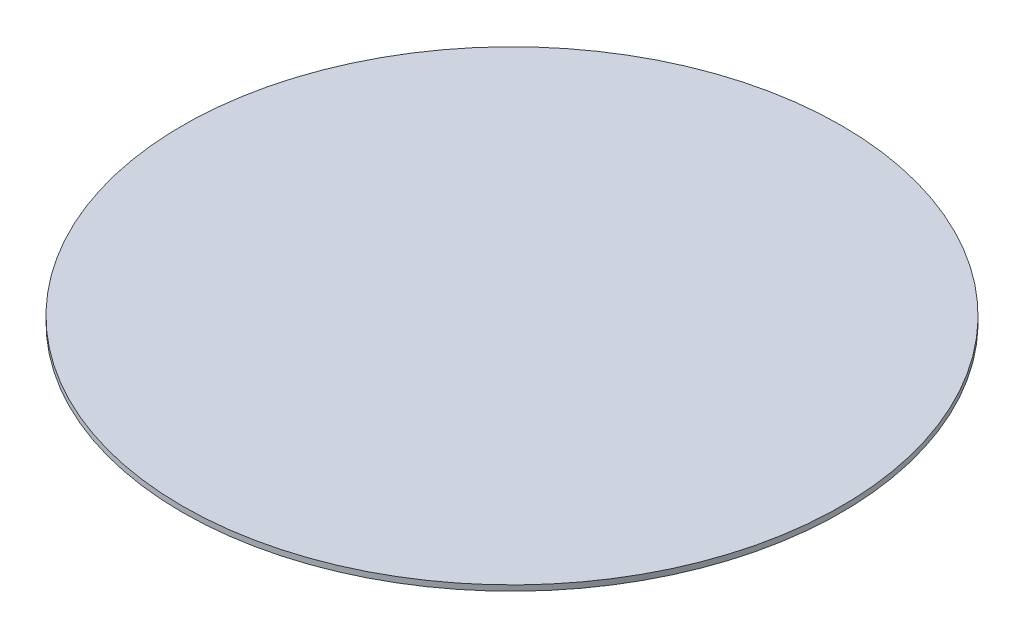
ISO-10303-21;
HEADER;
FILE_DESCRIPTION(('STEP AP214'),'2;1');
FILE_NAME('part.step','',(''),(''),'','','');
FILE_SCHEMA(('AUTOMOTIVE_DESIGN { 1 0 10303 214 1 1 1 1 }'));
ENDSEC;
DATA;
#1=APPLICATION_CONTEXT('core data for automotive mechanical design processes');
#2=APPLICATION_PROTOCOL_DEFINITION('international standard','automotive_design',2000,#1);
#3=PRODUCT_CONTEXT('',#1,'mechanical');
#4=PRODUCT('Part','Part','',(#3));
#5=PRODUCT_RELATED_PRODUCT_CATEGORY('part','',(#4));
#6=PRODUCT_DEFINITION_FORMATION('','',#4);
#7=PRODUCT_DEFINITION_CONTEXT('part definition',#1,'design');
#8=PRODUCT_DEFINITION('design','',#6,#7);
#9=PRODUCT_DEFINITION_SHAPE('','',#8);
#10=(LENGTH_UNIT() NAMED_UNIT(*) SI_UNIT(.MILLI.,.METRE.));
#11=(NAMED_UNIT(*) PLANE_ANGLE_UNIT() SI_UNIT($,.RADIAN.));
#12=(NAMED_UNIT(*) SI_UNIT($,.STERADIAN.) SOLID_ANGLE_UNIT());
#13=UNCERTAINTY_MEASURE_WITH_UNIT(LENGTH_MEASURE(1.E-05),#10,'distance_accuracy_value','');
#14=(GEOMETRIC_REPRESENTATION_CONTEXT(3) GLOBAL_UNCERTAINTY_ASSIGNED_CONTEXT((#13)) GLOBAL_UNIT_ASSIGNED_CONTEXT((#10,
#11,#12)) REPRESENTATION_CONTEXT('',''));
#15=CARTESIAN_POINT('',(0.,0.,0.));
#16=DIRECTION('',(0.,0.,1.));
#17=DIRECTION('',(1.,0.,0.));
#18=AXIS2_PLACEMENT_3D('',#15,#16,#17);
#19=CARTESIAN_POINT('',(0.,5.08,0.));
#20=DIRECTION('',(0.,-1.,0.));
#21=DIRECTION('',(0.,0.,-1.));
#22=AXIS2_PLACEMENT_3D('',#19,#20,#21);
#23=CYLINDRICAL_SURFACE('',#22,304.8);
#24=CARTESIAN_POINT('',(0.,5.08,0.));
#25=DIRECTION('',(0.,1.,0.));
#26=DIRECTION('',(0.,0.,1.));
#27=AXIS2_PLACEMENT_3D('',#24,#25,#26);
#28=CIRCLE('',#27,304.8);
#29=CARTESIAN_POINT('',(0.,5.08,304.8));
#30=VERTEX_POINT('',#29);
#31=EDGE_CURVE('E10',#30,#30,#28,.T.);
#32=ORIENTED_EDGE('',*,*,#31,.F.);
#33=EDGE_LOOP('',(#32));
#34=FACE_BOUND('',#33,.T.);
#35=CARTESIAN_POINT('',(0.,0.,0.));
#36=DIRECTION('',(0.,1.,0.));
#37=DIRECTION('',(0.,0.,1.));
#38=AXIS2_PLACEMENT_3D('',#35,#36,#37);
#39=CIRCLE('',#38,304.8);
#40=CARTESIAN_POINT('',(0.,0.,304.8));
#41=VERTEX_POINT('',#40);
#42=EDGE_CURVE('E36',#41,#41,#39,.T.);
#43=ORIENTED_EDGE('',*,*,#42,.T.);
#44=EDGE_LOOP('',(#43));
#45=FACE_BOUND('',#44,.T.);
#46=ADVANCED_FACE('F33',(#34,#45),#23,.T.);
#47=CARTESIAN_POINT('',(0.,5.08,0.));
#48=DIRECTION('',(0.,1.,0.));
#49=DIRECTION('',(0.,0.,1.));
#50=AXIS2_PLACEMENT_3D('',#47,#48,#49);
#51=PLANE('',#50);
#52=ORIENTED_EDGE('',*,*,#31,.T.);
#53=EDGE_LOOP('',(#52));
#54=FACE_BOUND('',#53,.T.);
#55=ADVANCED_FACE('F48',(#54),#51,.T.);
#56=CARTESIAN_POINT('',(0.,0.,0.));
#57=DIRECTION('',(0.,1.,0.));
#58=DIRECTION('',(0.,0.,1.));
#59=AXIS2_PLACEMENT_3D('',#56,#57,#58);
#60=PLANE('',#59);
#61=ORIENTED_EDGE('',*,*,#42,.F.);
#62=EDGE_LOOP('',(#61));
#63=FACE_BOUND('',#62,.T.);
#64=ADVANCED_FACE('F46',(#63),#60,.F.);
#65=CLOSED_SHELL('',(#46,#55,#64));
#66=MANIFOLD_SOLID_BREP('B2',#65);
#67=ADVANCED_BREP_SHAPE_REPRESENTATION('',(#18,#66),#14);
#68=SHAPE_DEFINITION_REPRESENTATION(#9,#67);
ENDSEC;
END-ISO-10303-21;
